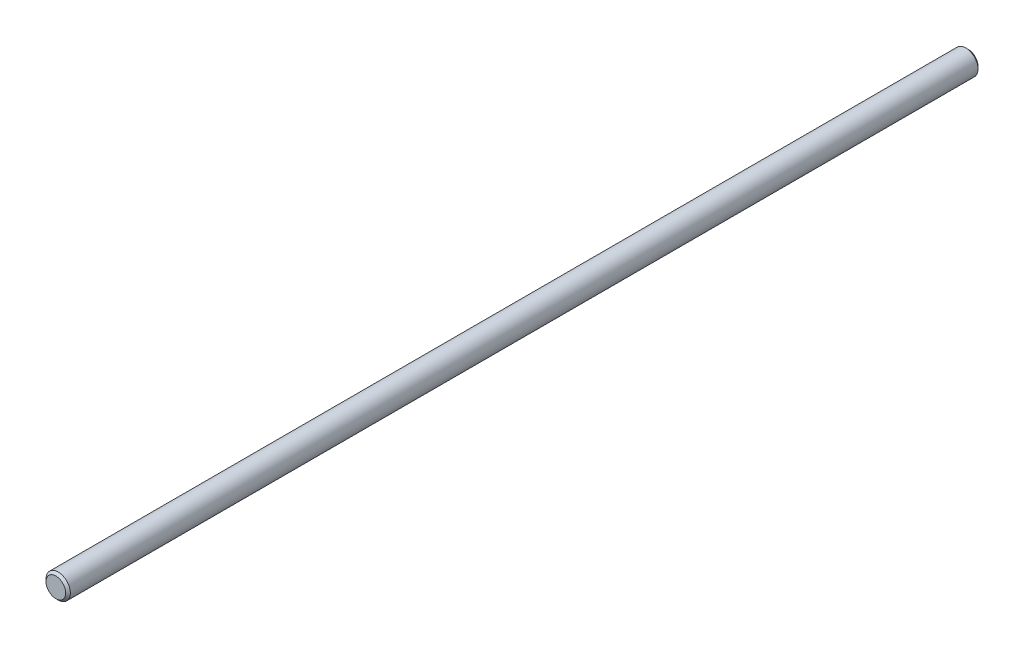
ISO-10303-21;
HEADER;
FILE_DESCRIPTION(('STEP AP214'),'2;1');
FILE_NAME('part.step','',(''),(''),'','','');
FILE_SCHEMA(('AUTOMOTIVE_DESIGN { 1 0 10303 214 1 1 1 1 }'));
ENDSEC;
DATA;
#1=APPLICATION_CONTEXT('core data for automotive mechanical design processes');
#2=APPLICATION_PROTOCOL_DEFINITION('international standard','automotive_design',2000,#1);
#3=PRODUCT_CONTEXT('',#1,'mechanical');
#4=PRODUCT('Part','Part','',(#3));
#5=PRODUCT_RELATED_PRODUCT_CATEGORY('part','',(#4));
#6=PRODUCT_DEFINITION_FORMATION('','',#4);
#7=PRODUCT_DEFINITION_CONTEXT('part definition',#1,'design');
#8=PRODUCT_DEFINITION('design','',#6,#7);
#9=PRODUCT_DEFINITION_SHAPE('','',#8);
#10=(LENGTH_UNIT() NAMED_UNIT(*) SI_UNIT(.MILLI.,.METRE.));
#11=(NAMED_UNIT(*) PLANE_ANGLE_UNIT() SI_UNIT($,.RADIAN.));
#12=(NAMED_UNIT(*) SI_UNIT($,.STERADIAN.) SOLID_ANGLE_UNIT());
#13=UNCERTAINTY_MEASURE_WITH_UNIT(LENGTH_MEASURE(1.E-05),#10,'distance_accuracy_value','');
#14=(GEOMETRIC_REPRESENTATION_CONTEXT(3) GLOBAL_UNCERTAINTY_ASSIGNED_CONTEXT((#13)) GLOBAL_UNIT_ASSIGNED_CONTEXT((#10,
#11,#12)) REPRESENTATION_CONTEXT('',''));
#15=CARTESIAN_POINT('',(0.,0.,0.));
#16=DIRECTION('',(0.,0.,1.));
#17=DIRECTION('',(1.,0.,0.));
#18=AXIS2_PLACEMENT_3D('',#15,#16,#17);
#19=CARTESIAN_POINT('',(0.,0.,150.));
#20=DIRECTION('',(0.,0.,-1.));
#21=DIRECTION('',(-1.,0.,0.));
#22=AXIS2_PLACEMENT_3D('',#19,#20,#21);
#23=CYLINDRICAL_SURFACE('',#22,2.);
#24=CARTESIAN_POINT('',(0.,0.,0.381000000000048));
#25=DIRECTION('',(0.,0.,1.));
#26=DIRECTION('',(1.,0.,0.));
#27=AXIS2_PLACEMENT_3D('',#24,#25,#26);
#28=CIRCLE('',#27,2.);
#29=CARTESIAN_POINT('',(2.,0.,0.381000000000048));
#30=VERTEX_POINT('',#29);
#31=EDGE_CURVE('E61',#30,#30,#28,.T.);
#32=ORIENTED_EDGE('',*,*,#31,.T.);
#33=EDGE_LOOP('',(#32));
#34=FACE_BOUND('',#33,.T.);
#35=CARTESIAN_POINT('',(0.,0.,149.619));
#36=DIRECTION('',(0.,0.,1.));
#37=DIRECTION('',(1.,0.,0.));
#38=AXIS2_PLACEMENT_3D('',#35,#36,#37);
#39=CIRCLE('',#38,2.);
#40=CARTESIAN_POINT('',(2.,0.,149.619));
#41=VERTEX_POINT('',#40);
#42=EDGE_CURVE('E66',#41,#41,#39,.F.);
#43=ORIENTED_EDGE('',*,*,#42,.T.);
#44=EDGE_LOOP('',(#43));
#45=FACE_BOUND('',#44,.T.);
#46=ADVANCED_FACE('F47',(#34,#45),#23,.T.);
#47=CARTESIAN_POINT('',(0.,0.,150.));
#48=DIRECTION('',(0.,0.,1.));
#49=DIRECTION('',(1.,0.,0.));
#50=AXIS2_PLACEMENT_3D('',#47,#48,#49);
#51=PLANE('',#50);
#52=CARTESIAN_POINT('',(0.,0.,150.));
#53=DIRECTION('',(0.,0.,1.));
#54=DIRECTION('',(1.,0.,0.));
#55=AXIS2_PLACEMENT_3D('',#52,#53,#54);
#56=CIRCLE('',#55,1.619);
#57=CARTESIAN_POINT('',(1.619,0.,150.));
#58=VERTEX_POINT('',#57);
#59=EDGE_CURVE('E10',#58,#58,#56,.T.);
#60=ORIENTED_EDGE('',*,*,#59,.T.);
#61=EDGE_LOOP('',(#60));
#62=FACE_BOUND('',#61,.T.);
#63=ADVANCED_FACE('F84',(#62),#51,.T.);
#64=CARTESIAN_POINT('',(0.,0.,0.));
#65=DIRECTION('',(0.,0.,1.));
#66=DIRECTION('',(1.,0.,0.));
#67=AXIS2_PLACEMENT_3D('',#64,#65,#66);
#68=PLANE('',#67);
#69=CARTESIAN_POINT('',(0.,0.,0.));
#70=DIRECTION('',(0.,0.,1.));
#71=DIRECTION('',(1.,0.,0.));
#72=AXIS2_PLACEMENT_3D('',#69,#70,#71);
#73=CIRCLE('',#72,1.61899999999997);
#74=CARTESIAN_POINT('',(1.61899999999997,0.,0.));
#75=VERTEX_POINT('',#74);
#76=EDGE_CURVE('E56',#75,#75,#73,.F.);
#77=ORIENTED_EDGE('',*,*,#76,.T.);
#78=EDGE_LOOP('',(#77));
#79=FACE_BOUND('',#78,.T.);
#80=ADVANCED_FACE('F81',(#79),#68,.F.);
#81=CARTESIAN_POINT('',(0.,0.,0.381000000000048));
#82=DIRECTION('',(0.,0.,1.));
#83=DIRECTION('',(1.,0.,0.));
#84=AXIS2_PLACEMENT_3D('',#81,#82,#83);
#85=CONICAL_SURFACE('',#84,2.,0.785398163397428);
#86=ORIENTED_EDGE('',*,*,#76,.F.);
#87=EDGE_LOOP('',(#86));
#88=FACE_BOUND('',#87,.T.);
#89=ORIENTED_EDGE('',*,*,#31,.F.);
#90=EDGE_LOOP('',(#89));
#91=FACE_BOUND('',#90,.T.);
#92=ADVANCED_FACE('F76',(#88,#91),#85,.T.);
#93=CARTESIAN_POINT('',(0.,0.,150.));
#94=DIRECTION('',(0.,0.,-1.));
#95=DIRECTION('',(-1.,0.,0.));
#96=AXIS2_PLACEMENT_3D('',#93,#94,#95);
#97=CONICAL_SURFACE('',#96,1.619,0.785398163397464);
#98=ORIENTED_EDGE('',*,*,#42,.F.);
#99=EDGE_LOOP('',(#98));
#100=FACE_BOUND('',#99,.T.);
#101=ORIENTED_EDGE('',*,*,#59,.F.);
#102=EDGE_LOOP('',(#101));
#103=FACE_BOUND('',#102,.T.);
#104=ADVANCED_FACE('F50',(#100,#103),#97,.T.);
#105=CLOSED_SHELL('',(#46,#63,#80,#92,#104));
#106=MANIFOLD_SOLID_BREP('B2',#105);
#107=ADVANCED_BREP_SHAPE_REPRESENTATION('',(#18,#106),#14);
#108=SHAPE_DEFINITION_REPRESENTATION(#9,#107);
ENDSEC;
END-ISO-10303-21;
